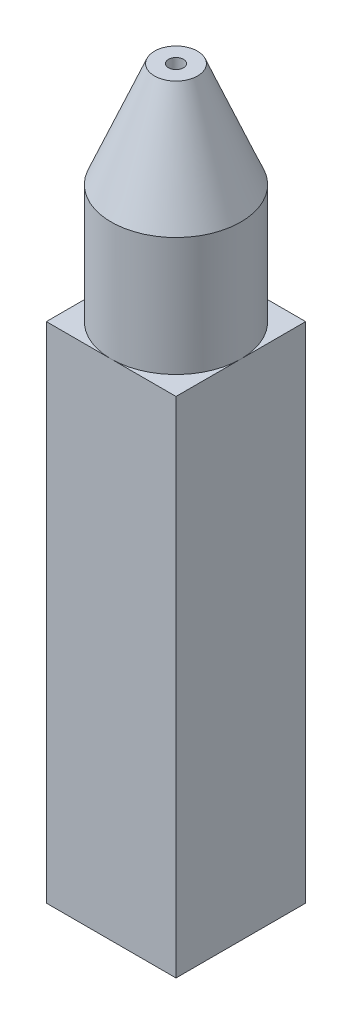
ISO-10303-21;
HEADER;
FILE_DESCRIPTION(('STEP AP214'),'2;1');
FILE_NAME('part.step','',(''),(''),'','','');
FILE_SCHEMA(('AUTOMOTIVE_DESIGN { 1 0 10303 214 1 1 1 1 }'));
ENDSEC;
DATA;
#1=APPLICATION_CONTEXT('core data for automotive mechanical design processes');
#2=APPLICATION_PROTOCOL_DEFINITION('international standard','automotive_design',2000,#1);
#3=PRODUCT_CONTEXT('',#1,'mechanical');
#4=PRODUCT('Part','Part','',(#3));
#5=PRODUCT_RELATED_PRODUCT_CATEGORY('part','',(#4));
#6=PRODUCT_DEFINITION_FORMATION('','',#4);
#7=PRODUCT_DEFINITION_CONTEXT('part definition',#1,'design');
#8=PRODUCT_DEFINITION('design','',#6,#7);
#9=PRODUCT_DEFINITION_SHAPE('','',#8);
#10=(LENGTH_UNIT() NAMED_UNIT(*) SI_UNIT(.MILLI.,.METRE.));
#11=(NAMED_UNIT(*) PLANE_ANGLE_UNIT() SI_UNIT($,.RADIAN.));
#12=(NAMED_UNIT(*) SI_UNIT($,.STERADIAN.) SOLID_ANGLE_UNIT());
#13=UNCERTAINTY_MEASURE_WITH_UNIT(LENGTH_MEASURE(1.E-05),#10,'distance_accuracy_value','');
#14=(GEOMETRIC_REPRESENTATION_CONTEXT(3) GLOBAL_UNCERTAINTY_ASSIGNED_CONTEXT((#13)) GLOBAL_UNIT_ASSIGNED_CONTEXT((#10,
#11,#12)) REPRESENTATION_CONTEXT('',''));
#15=CARTESIAN_POINT('',(0.,0.,0.));
#16=DIRECTION('',(0.,0.,1.));
#17=DIRECTION('',(1.,0.,0.));
#18=AXIS2_PLACEMENT_3D('',#15,#16,#17);
#19=CARTESIAN_POINT('',(0.,0.,0.));
#20=DIRECTION('',(0.,-1.,0.));
#21=DIRECTION('',(0.,0.,-1.));
#22=AXIS2_PLACEMENT_3D('',#19,#20,#21);
#23=PLANE('',#22);
#24=DIRECTION('',(1.,0.,0.));
#25=VECTOR('',#24,1.);
#26=CARTESIAN_POINT('',(0.,0.,2.9845));
#27=LINE('',#26,#25);
#28=CARTESIAN_POINT('',(-2.9845,0.,2.9845));
#29=VERTEX_POINT('',#28);
#30=CARTESIAN_POINT('',(2.9845,0.,2.9845));
#31=VERTEX_POINT('',#30);
#32=EDGE_CURVE('E131',#29,#31,#27,.T.);
#33=ORIENTED_EDGE('',*,*,#32,.F.);
#34=DIRECTION('',(0.,0.,-1.));
#35=VECTOR('',#34,1.);
#36=CARTESIAN_POINT('',(-2.9845,0.,0.));
#37=LINE('',#36,#35);
#38=CARTESIAN_POINT('',(-2.9845,0.,-2.9845));
#39=VERTEX_POINT('',#38);
#40=EDGE_CURVE('E125',#29,#39,#37,.T.);
#41=ORIENTED_EDGE('',*,*,#40,.T.);
#42=DIRECTION('',(1.,0.,0.));
#43=VECTOR('',#42,1.);
#44=CARTESIAN_POINT('',(0.,0.,-2.9845));
#45=LINE('',#44,#43);
#46=CARTESIAN_POINT('',(2.9845,0.,-2.9845));
#47=VERTEX_POINT('',#46);
#48=EDGE_CURVE('E129',#39,#47,#45,.T.);
#49=ORIENTED_EDGE('',*,*,#48,.T.);
#50=DIRECTION('',(0.,0.,-1.));
#51=VECTOR('',#50,1.);
#52=CARTESIAN_POINT('',(2.9845,0.,0.));
#53=LINE('',#52,#51);
#54=EDGE_CURVE('E176',#31,#47,#53,.T.);
#55=ORIENTED_EDGE('',*,*,#54,.F.);
#56=EDGE_LOOP('',(#33,#41,#49,#55));
#57=FACE_BOUND('',#56,.T.);
#58=CARTESIAN_POINT('',(0.,0.,0.));
#59=DIRECTION('',(0.,-1.,0.));
#60=DIRECTION('',(0.,0.,-1.));
#61=AXIS2_PLACEMENT_3D('',#58,#59,#60);
#62=CIRCLE('',#61,0.9906);
#63=CARTESIAN_POINT('',(0.,0.,-0.9906));
#64=VERTEX_POINT('',#63);
#65=EDGE_CURVE('E12',#64,#64,#62,.T.);
#66=ORIENTED_EDGE('',*,*,#65,.F.);
#67=EDGE_LOOP('',(#66));
#68=FACE_BOUND('',#67,.T.);
#69=ADVANCED_FACE('F71',(#57,#68),#23,.T.);
#70=CARTESIAN_POINT('',(0.,0.,0.));
#71=DIRECTION('',(0.,-1.,0.));
#72=DIRECTION('',(0.,0.,-1.));
#73=AXIS2_PLACEMENT_3D('',#70,#71,#72);
#74=CYLINDRICAL_SURFACE('',#73,0.9906);
#75=ORIENTED_EDGE('',*,*,#65,.T.);
#76=EDGE_LOOP('',(#75));
#77=FACE_BOUND('',#76,.T.);
#78=CARTESIAN_POINT('',(0.,8.19360069193763,0.));
#79=DIRECTION('',(0.,-1.,0.));
#80=DIRECTION('',(0.,0.,-1.));
#81=AXIS2_PLACEMENT_3D('',#78,#79,#80);
#82=CIRCLE('',#81,0.990600000000001);
#83=CARTESIAN_POINT('',(0.,8.19360069193763,-0.990600000000001));
#84=VERTEX_POINT('',#83);
#85=EDGE_CURVE('E78',#84,#84,#82,.T.);
#86=ORIENTED_EDGE('',*,*,#85,.F.);
#87=EDGE_LOOP('',(#86));
#88=FACE_BOUND('',#87,.T.);
#89=ADVANCED_FACE('F200',(#77,#88),#74,.F.);
#90=CARTESIAN_POINT('',(0.,9.31545,0.));
#91=DIRECTION('',(0.,-1.,0.));
#92=DIRECTION('',(0.,0.,-1.));
#93=AXIS2_PLACEMENT_3D('',#90,#91,#92);
#94=CONICAL_SURFACE('',#93,0.342899999999998,0.5235987755983);
#95=ORIENTED_EDGE('',*,*,#85,.T.);
#96=EDGE_LOOP('',(#95));
#97=FACE_BOUND('',#96,.T.);
#98=CARTESIAN_POINT('',(0.,9.31545,0.));
#99=DIRECTION('',(0.,-1.,0.));
#100=DIRECTION('',(0.,0.,-1.));
#101=AXIS2_PLACEMENT_3D('',#98,#99,#100);
#102=CIRCLE('',#101,0.342899999999998);
#103=CARTESIAN_POINT('',(0.,9.31545,-0.342899999999998));
#104=VERTEX_POINT('',#103);
#105=EDGE_CURVE('E192',#104,#104,#102,.T.);
#106=ORIENTED_EDGE('',*,*,#105,.F.);
#107=EDGE_LOOP('',(#106));
#108=FACE_BOUND('',#107,.T.);
#109=ADVANCED_FACE('F197',(#97,#108),#94,.F.);
#110=CARTESIAN_POINT('',(0.,0.,0.));
#111=DIRECTION('',(0.,-1.,0.));
#112=DIRECTION('',(0.,0.,-1.));
#113=AXIS2_PLACEMENT_3D('',#110,#111,#112);
#114=CYLINDRICAL_SURFACE('',#113,0.342899999999999);
#115=ORIENTED_EDGE('',*,*,#105,.T.);
#116=EDGE_LOOP('',(#115));
#117=FACE_BOUND('',#116,.T.);
#118=CARTESIAN_POINT('',(0.,33.47085,0.));
#119=DIRECTION('',(0.,-1.,0.));
#120=DIRECTION('',(0.,0.,-1.));
#121=AXIS2_PLACEMENT_3D('',#118,#119,#120);
#122=CIRCLE('',#121,0.3429);
#123=CARTESIAN_POINT('',(0.,33.47085,-0.3429));
#124=VERTEX_POINT('',#123);
#125=EDGE_CURVE('E189',#124,#124,#122,.T.);
#126=ORIENTED_EDGE('',*,*,#125,.F.);
#127=EDGE_LOOP('',(#126));
#128=FACE_BOUND('',#127,.T.);
#129=ADVANCED_FACE('F207',(#117,#128),#114,.F.);
#130=CARTESIAN_POINT('',(0.,33.47085,0.));
#131=DIRECTION('',(0.,-1.,0.));
#132=DIRECTION('',(0.,0.,-1.));
#133=AXIS2_PLACEMENT_3D('',#130,#131,#132);
#134=PLANE('',#133);
#135=CARTESIAN_POINT('',(0.,33.47085,0.));
#136=DIRECTION('',(0.,-1.,0.));
#137=DIRECTION('',(0.,0.,-1.));
#138=AXIS2_PLACEMENT_3D('',#135,#136,#137);
#139=CIRCLE('',#138,0.9906);
#140=CARTESIAN_POINT('',(0.,33.47085,-0.990599999999998));
#141=VERTEX_POINT('',#140);
#142=EDGE_CURVE('E186',#141,#141,#139,.T.);
#143=ORIENTED_EDGE('',*,*,#142,.F.);
#144=EDGE_LOOP('',(#143));
#145=FACE_BOUND('',#144,.T.);
#146=ORIENTED_EDGE('',*,*,#125,.T.);
#147=EDGE_LOOP('',(#146));
#148=FACE_BOUND('',#147,.T.);
#149=ADVANCED_FACE('F212',(#145,#148),#134,.F.);
#150=CARTESIAN_POINT('',(0.,33.47085,0.));
#151=DIRECTION('',(0.,-1.,0.));
#152=DIRECTION('',(0.,0.,-1.));
#153=AXIS2_PLACEMENT_3D('',#150,#151,#152);
#154=CONICAL_SURFACE('',#153,0.9906,0.391797676816774);
#155=CARTESIAN_POINT('',(0.,28.64485,0.));
#156=DIRECTION('',(0.,-1.,0.));
#157=DIRECTION('',(0.,0.,-1.));
#158=AXIS2_PLACEMENT_3D('',#155,#156,#157);
#159=CIRCLE('',#158,2.9845);
#160=CARTESIAN_POINT('',(0.,28.64485,-2.9845));
#161=VERTEX_POINT('',#160);
#162=EDGE_CURVE('E180',#161,#161,#159,.T.);
#163=CARTESIAN_POINT('',(0.,28.64485,-2.9845));
#164=CARTESIAN_POINT('',(0.,28.6951208333333,-2.96373020833334));
#165=CARTESIAN_POINT('',(0.,28.7453916666667,-2.94296041666667));
#166=CARTESIAN_POINT('',(0.,28.8459333333333,-2.90142083333334));
#167=CARTESIAN_POINT('',(0.,28.8962041666667,-2.88065104166667));
#168=CARTESIAN_POINT('',(0.,28.9967458333333,-2.83911145833333));
#169=CARTESIAN_POINT('',(0.,29.0470166666667,-2.81834166666667));
#170=CARTESIAN_POINT('',(0.,29.1475583333333,-2.77680208333333));
#171=CARTESIAN_POINT('',(0.,29.1978291666667,-2.75603229166667));
#172=CARTESIAN_POINT('',(0.,29.2983708333333,-2.71449270833333));
#173=CARTESIAN_POINT('',(0.,29.3486416666667,-2.69372291666667));
#174=CARTESIAN_POINT('',(0.,29.4491833333333,-2.65218333333333));
#175=CARTESIAN_POINT('',(0.,29.4994541666667,-2.63141354166667));
#176=CARTESIAN_POINT('',(0.,29.5999958333333,-2.58987395833333));
#177=CARTESIAN_POINT('',(0.,29.6502666666667,-2.56910416666667));
#178=CARTESIAN_POINT('',(0.,29.7508083333333,-2.52756458333333));
#179=CARTESIAN_POINT('',(0.,29.8010791666667,-2.50679479166667));
#180=CARTESIAN_POINT('',(0.,29.9016208333333,-2.46525520833333));
#181=CARTESIAN_POINT('',(0.,29.9518916666667,-2.44448541666667));
#182=CARTESIAN_POINT('',(0.,30.0524333333333,-2.40294583333333));
#183=CARTESIAN_POINT('',(0.,30.1027041666667,-2.38217604166667));
#184=CARTESIAN_POINT('',(0.,30.2032458333333,-2.34063645833333));
#185=CARTESIAN_POINT('',(0.,30.2535166666667,-2.31986666666667));
#186=CARTESIAN_POINT('',(0.,30.3540583333333,-2.27832708333333));
#187=CARTESIAN_POINT('',(0.,30.4043291666667,-2.25755729166667));
#188=CARTESIAN_POINT('',(0.,30.5048708333333,-2.21601770833333));
#189=CARTESIAN_POINT('',(0.,30.5551416666667,-2.19524791666667));
#190=CARTESIAN_POINT('',(0.,30.6556833333333,-2.15370833333333));
#191=CARTESIAN_POINT('',(0.,30.7059541666667,-2.13293854166667));
#192=CARTESIAN_POINT('',(0.,30.8064958333333,-2.09139895833333));
#193=CARTESIAN_POINT('',(0.,30.8567666666667,-2.07062916666667));
#194=CARTESIAN_POINT('',(0.,30.9573083333333,-2.02908958333333));
#195=CARTESIAN_POINT('',(0.,31.0075791666667,-2.00831979166667));
#196=CARTESIAN_POINT('',(0.,31.1081208333333,-1.96678020833333));
#197=CARTESIAN_POINT('',(0.,31.1583916666667,-1.94601041666667));
#198=CARTESIAN_POINT('',(0.,31.2589333333333,-1.90447083333333));
#199=CARTESIAN_POINT('',(0.,31.3092041666667,-1.88370104166667));
#200=CARTESIAN_POINT('',(0.,31.4097458333333,-1.84216145833333));
#201=CARTESIAN_POINT('',(0.,31.4600166666667,-1.82139166666667));
#202=CARTESIAN_POINT('',(0.,31.5605583333333,-1.77985208333333));
#203=CARTESIAN_POINT('',(0.,31.6108291666667,-1.75908229166667));
#204=CARTESIAN_POINT('',(0.,31.7113708333333,-1.71754270833333));
#205=CARTESIAN_POINT('',(0.,31.7616416666667,-1.69677291666667));
#206=CARTESIAN_POINT('',(0.,31.8621833333333,-1.65523333333333));
#207=CARTESIAN_POINT('',(0.,31.9124541666667,-1.63446354166667));
#208=CARTESIAN_POINT('',(0.,32.0129958333333,-1.59292395833333));
#209=CARTESIAN_POINT('',(0.,32.0632666666667,-1.57215416666667));
#210=CARTESIAN_POINT('',(0.,32.1638083333333,-1.53061458333333));
#211=CARTESIAN_POINT('',(0.,32.2140791666667,-1.50984479166667));
#212=CARTESIAN_POINT('',(0.,32.3146208333333,-1.46830520833333));
#213=CARTESIAN_POINT('',(0.,32.3648916666667,-1.44753541666667));
#214=CARTESIAN_POINT('',(0.,32.4654333333333,-1.40599583333333));
#215=CARTESIAN_POINT('',(0.,32.5157041666667,-1.38522604166667));
#216=CARTESIAN_POINT('',(0.,32.6162458333333,-1.34368645833333));
#217=CARTESIAN_POINT('',(0.,32.6665166666667,-1.32291666666667));
#218=CARTESIAN_POINT('',(0.,32.7670583333333,-1.28137708333333));
#219=CARTESIAN_POINT('',(0.,32.8173291666667,-1.26060729166667));
#220=CARTESIAN_POINT('',(0.,32.9178708333333,-1.21906770833333));
#221=CARTESIAN_POINT('',(0.,32.9681416666667,-1.19829791666667));
#222=CARTESIAN_POINT('',(0.,33.0686833333333,-1.15675833333333));
#223=CARTESIAN_POINT('',(0.,33.1189541666667,-1.13598854166667));
#224=CARTESIAN_POINT('',(0.,33.2194958333333,-1.09444895833333));
#225=CARTESIAN_POINT('',(0.,33.2697666666667,-1.07367916666667));
#226=CARTESIAN_POINT('',(0.,33.3703083333333,-1.03213958333333));
#227=CARTESIAN_POINT('',(0.,33.4205791666667,-1.01136979166667));
#228=CARTESIAN_POINT('',(0.,33.47085,-0.990599999999998));
#229=B_SPLINE_CURVE_WITH_KNOTS('',3,(#163,#164,#165,#166,#167,#168,#169,#170,#171,#172,#173,
#174,#175,#176,#177,#178,#179,#180,#181,#182,#183,#184,#185,#186,#187,#188,#189,#190,#191,#192,
#193,#194,#195,#196,#197,#198,#199,#200,#201,#202,#203,#204,#205,#206,#207,#208,#209,#210,#211,
#212,#213,#214,#215,#216,#217,#218,#219,#220,#221,#222,#223,#224,#225,#226,#227,#228),
.UNSPECIFIED.,.F.,.F.,(4,2,2,2,2,2,2,2,2,2,2,2,2,2,2,2,2,2,2,2,2,2,2,2,2,2,2,2,2,2,2,2,4),(0.,
0.163177413783712,0.326354827567423,0.489532241351135,0.652709655134846,0.815887068918558,
0.979064482702269,1.14224189648598,1.30541931026969,1.4685967240534,1.63177413783712,
1.79495155162083,1.95812896540454,2.12130637918825,2.28448379297196,2.44766120675567,
2.61083862053938,2.7740160343231,2.93719344810681,3.10037086189052,3.26354827567423,
3.42672568945794,3.58990310324165,3.75308051702537,3.91625793080908,4.07943534459279,
4.2426127583765,4.40579017216021,4.56896758594392,4.73214499972764,4.89532241351135,
5.05849982729506,5.22167724107877),.UNSPECIFIED.);
#230=EDGE_CURVE('BSEAM216',#161,#141,#229,.T.);
#231=ORIENTED_EDGE('',*,*,#162,.F.);
#232=ORIENTED_EDGE('',*,*,#142,.T.);
#233=ORIENTED_EDGE('',*,*,#230,.T.);
#234=ORIENTED_EDGE('',*,*,#230,.F.);
#235=EDGE_LOOP('',(#231,#233,#232,#234));
#236=FACE_BOUND('',#235,.T.);
#237=ADVANCED_FACE('F216',(#236),#154,.T.);
#238=CARTESIAN_POINT('',(0.,0.,0.));
#239=DIRECTION('',(0.,-1.,0.));
#240=DIRECTION('',(0.,0.,-1.));
#241=AXIS2_PLACEMENT_3D('',#238,#239,#240);
#242=CYLINDRICAL_SURFACE('',#241,2.9845);
#243=CARTESIAN_POINT('',(0.,23.18385,0.));
#244=DIRECTION('',(0.,1.,0.));
#245=DIRECTION('',(0.,0.,1.));
#246=AXIS2_PLACEMENT_3D('',#243,#244,#245);
#247=CIRCLE('',#246,2.9845);
#248=CARTESIAN_POINT('',(0.,23.18385,-2.9845));
#249=VERTEX_POINT('',#248);
#250=CARTESIAN_POINT('',(2.9845,23.18385,0.));
#251=VERTEX_POINT('',#250);
#252=EDGE_CURVE('E85',#249,#251,#247,.F.);
#253=ORIENTED_EDGE('',*,*,#252,.F.);
#254=CARTESIAN_POINT('',(0.,23.18385,0.));
#255=DIRECTION('',(0.,1.,0.));
#256=DIRECTION('',(0.,0.,1.));
#257=AXIS2_PLACEMENT_3D('',#254,#255,#256);
#258=CIRCLE('',#257,2.9845);
#259=CARTESIAN_POINT('',(-2.9845,23.18385,0.));
#260=VERTEX_POINT('',#259);
#261=EDGE_CURVE('E160',#260,#249,#258,.F.);
#262=ORIENTED_EDGE('',*,*,#261,.F.);
#263=CARTESIAN_POINT('',(0.,23.18385,0.));
#264=DIRECTION('',(0.,1.,0.));
#265=DIRECTION('',(0.,0.,1.));
#266=AXIS2_PLACEMENT_3D('',#263,#264,#265);
#267=CIRCLE('',#266,2.9845);
#268=CARTESIAN_POINT('',(0.,23.18385,2.9845));
#269=VERTEX_POINT('',#268);
#270=EDGE_CURVE('E137',#269,#260,#267,.F.);
#271=ORIENTED_EDGE('',*,*,#270,.F.);
#272=CARTESIAN_POINT('',(0.,23.18385,0.));
#273=DIRECTION('',(0.,1.,0.));
#274=DIRECTION('',(0.,0.,1.));
#275=AXIS2_PLACEMENT_3D('',#272,#273,#274);
#276=CIRCLE('',#275,2.9845);
#277=EDGE_CURVE('E178',#251,#269,#276,.F.);
#278=ORIENTED_EDGE('',*,*,#277,.F.);
#279=EDGE_LOOP('',(#253,#262,#271,#278));
#280=FACE_BOUND('',#279,.T.);
#281=ORIENTED_EDGE('',*,*,#162,.T.);
#282=EDGE_LOOP('',(#281));
#283=FACE_BOUND('',#282,.T.);
#284=ADVANCED_FACE('F220',(#280,#283),#242,.T.);
#285=CARTESIAN_POINT('',(2.9845,27.4045703769025,0.));
#286=DIRECTION('',(-1.,0.,0.));
#287=DIRECTION('',(0.,0.,1.));
#288=AXIS2_PLACEMENT_3D('',#285,#286,#287);
#289=PLANE('',#288);
#290=DIRECTION('',(0.,0.,-1.));
#291=VECTOR('',#290,1.);
#292=CARTESIAN_POINT('',(2.9845,23.18385,0.));
#293=LINE('',#292,#291);
#294=CARTESIAN_POINT('',(2.9845,23.18385,2.9845));
#295=VERTEX_POINT('',#294);
#296=EDGE_CURVE('E93',#295,#251,#293,.T.);
#297=ORIENTED_EDGE('',*,*,#296,.F.);
#298=DIRECTION('',(0.,-1.,0.));
#299=VECTOR('',#298,1.);
#300=CARTESIAN_POINT('',(2.9845,27.4045703769025,2.9845));
#301=LINE('',#300,#299);
#302=EDGE_CURVE('E169',#295,#31,#301,.T.);
#303=ORIENTED_EDGE('',*,*,#302,.T.);
#304=ORIENTED_EDGE('',*,*,#54,.T.);
#305=DIRECTION('',(0.,-1.,0.));
#306=VECTOR('',#305,1.);
#307=CARTESIAN_POINT('',(2.9845,27.4045703769025,-2.9845));
#308=LINE('',#307,#306);
#309=CARTESIAN_POINT('',(2.9845,23.18385,-2.9845));
#310=VERTEX_POINT('',#309);
#311=EDGE_CURVE('E146',#310,#47,#308,.T.);
#312=ORIENTED_EDGE('',*,*,#311,.F.);
#313=DIRECTION('',(0.,0.,-1.));
#314=VECTOR('',#313,1.);
#315=CARTESIAN_POINT('',(2.9845,23.18385,0.));
#316=LINE('',#315,#314);
#317=EDGE_CURVE('E163',#251,#310,#316,.T.);
#318=ORIENTED_EDGE('',*,*,#317,.F.);
#319=EDGE_LOOP('',(#297,#303,#304,#312,#318));
#320=FACE_BOUND('',#319,.T.);
#321=ADVANCED_FACE('F224',(#320),#289,.F.);
#322=CARTESIAN_POINT('',(0.,27.4045703769025,2.9845));
#323=DIRECTION('',(0.,0.,-1.));
#324=DIRECTION('',(-1.,0.,0.));
#325=AXIS2_PLACEMENT_3D('',#322,#323,#324);
#326=PLANE('',#325);
#327=DIRECTION('',(1.,0.,0.));
#328=VECTOR('',#327,1.);
#329=CARTESIAN_POINT('',(0.,23.18385,2.9845));
#330=LINE('',#329,#328);
#331=EDGE_CURVE('E175',#269,#295,#330,.T.);
#332=ORIENTED_EDGE('',*,*,#331,.F.);
#333=DIRECTION('',(1.,0.,0.));
#334=VECTOR('',#333,1.);
#335=CARTESIAN_POINT('',(0.,23.18385,2.9845));
#336=LINE('',#335,#334);
#337=CARTESIAN_POINT('',(-2.9845,23.18385,2.9845));
#338=VERTEX_POINT('',#337);
#339=EDGE_CURVE('E165',#338,#269,#336,.T.);
#340=ORIENTED_EDGE('',*,*,#339,.F.);
#341=DIRECTION('',(0.,-1.,0.));
#342=VECTOR('',#341,1.);
#343=CARTESIAN_POINT('',(-2.9845,27.4045703769025,2.9845));
#344=LINE('',#343,#342);
#345=EDGE_CURVE('E167',#338,#29,#344,.T.);
#346=ORIENTED_EDGE('',*,*,#345,.T.);
#347=ORIENTED_EDGE('',*,*,#32,.T.);
#348=ORIENTED_EDGE('',*,*,#302,.F.);
#349=EDGE_LOOP('',(#332,#340,#346,#347,#348));
#350=FACE_BOUND('',#349,.T.);
#351=ADVANCED_FACE('F229',(#350),#326,.F.);
#352=CARTESIAN_POINT('',(0.,23.18385,0.));
#353=DIRECTION('',(0.,1.,0.));
#354=DIRECTION('',(0.,0.,1.));
#355=AXIS2_PLACEMENT_3D('',#352,#353,#354);
#356=PLANE('',#355);
#357=ORIENTED_EDGE('',*,*,#331,.T.);
#358=ORIENTED_EDGE('',*,*,#296,.T.);
#359=ORIENTED_EDGE('',*,*,#277,.T.);
#360=EDGE_LOOP('',(#357,#358,#359));
#361=FACE_BOUND('',#360,.T.);
#362=ADVANCED_FACE('F225',(#361),#356,.T.);
#363=CARTESIAN_POINT('',(0.,23.18385,0.));
#364=DIRECTION('',(0.,1.,0.));
#365=DIRECTION('',(0.,0.,1.));
#366=AXIS2_PLACEMENT_3D('',#363,#364,#365);
#367=PLANE('',#366);
#368=DIRECTION('',(0.,0.,-1.));
#369=VECTOR('',#368,1.);
#370=CARTESIAN_POINT('',(-2.9845,23.18385,0.));
#371=LINE('',#370,#369);
#372=EDGE_CURVE('E136',#338,#260,#371,.T.);
#373=ORIENTED_EDGE('',*,*,#372,.F.);
#374=ORIENTED_EDGE('',*,*,#339,.T.);
#375=ORIENTED_EDGE('',*,*,#270,.T.);
#376=EDGE_LOOP('',(#373,#374,#375));
#377=FACE_BOUND('',#376,.T.);
#378=ADVANCED_FACE('F228',(#377),#367,.T.);
#379=CARTESIAN_POINT('',(-2.9845,27.4045703769025,0.));
#380=DIRECTION('',(-1.,0.,0.));
#381=DIRECTION('',(0.,0.,1.));
#382=AXIS2_PLACEMENT_3D('',#379,#380,#381);
#383=PLANE('',#382);
#384=ORIENTED_EDGE('',*,*,#345,.F.);
#385=ORIENTED_EDGE('',*,*,#372,.T.);
#386=DIRECTION('',(0.,0.,-1.));
#387=VECTOR('',#386,1.);
#388=CARTESIAN_POINT('',(-2.9845,23.18385,0.));
#389=LINE('',#388,#387);
#390=CARTESIAN_POINT('',(-2.9845,23.18385,-2.9845));
#391=VERTEX_POINT('',#390);
#392=EDGE_CURVE('E152',#260,#391,#389,.T.);
#393=ORIENTED_EDGE('',*,*,#392,.T.);
#394=DIRECTION('',(0.,-1.,0.));
#395=VECTOR('',#394,1.);
#396=CARTESIAN_POINT('',(-2.9845,27.4045703769025,-2.9845));
#397=LINE('',#396,#395);
#398=EDGE_CURVE('E144',#391,#39,#397,.T.);
#399=ORIENTED_EDGE('',*,*,#398,.T.);
#400=ORIENTED_EDGE('',*,*,#40,.F.);
#401=EDGE_LOOP('',(#384,#385,#393,#399,#400));
#402=FACE_BOUND('',#401,.T.);
#403=ADVANCED_FACE('F149',(#402),#383,.T.);
#404=CARTESIAN_POINT('',(0.,27.4045703769025,-2.9845));
#405=DIRECTION('',(0.,0.,-1.));
#406=DIRECTION('',(-1.,0.,0.));
#407=AXIS2_PLACEMENT_3D('',#404,#405,#406);
#408=PLANE('',#407);
#409=ORIENTED_EDGE('',*,*,#48,.F.);
#410=ORIENTED_EDGE('',*,*,#398,.F.);
#411=DIRECTION('',(1.,0.,0.));
#412=VECTOR('',#411,1.);
#413=CARTESIAN_POINT('',(0.,23.18385,-2.9845));
#414=LINE('',#413,#412);
#415=EDGE_CURVE('E156',#391,#249,#414,.T.);
#416=ORIENTED_EDGE('',*,*,#415,.T.);
#417=DIRECTION('',(1.,0.,0.));
#418=VECTOR('',#417,1.);
#419=CARTESIAN_POINT('',(0.,23.18385,-2.9845));
#420=LINE('',#419,#418);
#421=EDGE_CURVE('E153',#249,#310,#420,.T.);
#422=ORIENTED_EDGE('',*,*,#421,.T.);
#423=ORIENTED_EDGE('',*,*,#311,.T.);
#424=EDGE_LOOP('',(#409,#410,#416,#422,#423));
#425=FACE_BOUND('',#424,.T.);
#426=ADVANCED_FACE('F142',(#425),#408,.T.);
#427=CARTESIAN_POINT('',(0.,23.18385,0.));
#428=DIRECTION('',(0.,1.,0.));
#429=DIRECTION('',(0.,0.,1.));
#430=AXIS2_PLACEMENT_3D('',#427,#428,#429);
#431=PLANE('',#430);
#432=ORIENTED_EDGE('',*,*,#252,.T.);
#433=ORIENTED_EDGE('',*,*,#317,.T.);
#434=ORIENTED_EDGE('',*,*,#421,.F.);
#435=EDGE_LOOP('',(#432,#433,#434));
#436=FACE_BOUND('',#435,.T.);
#437=ADVANCED_FACE('F243',(#436),#431,.T.);
#438=CARTESIAN_POINT('',(0.,23.18385,0.));
#439=DIRECTION('',(0.,1.,0.));
#440=DIRECTION('',(0.,0.,1.));
#441=AXIS2_PLACEMENT_3D('',#438,#439,#440);
#442=PLANE('',#441);
#443=ORIENTED_EDGE('',*,*,#392,.F.);
#444=ORIENTED_EDGE('',*,*,#261,.T.);
#445=ORIENTED_EDGE('',*,*,#415,.F.);
#446=EDGE_LOOP('',(#443,#444,#445));
#447=FACE_BOUND('',#446,.T.);
#448=ADVANCED_FACE('F246',(#447),#442,.T.);
#449=CLOSED_SHELL('',(#69,#89,#109,#129,#149,#237,#284,#321,#351,#362,#378,#403,#426,#437,#448));
#450=MANIFOLD_SOLID_BREP('B2',#449);
#451=ADVANCED_BREP_SHAPE_REPRESENTATION('',(#18,#450),#14);
#452=SHAPE_DEFINITION_REPRESENTATION(#9,#451);
ENDSEC;
END-ISO-10303-21;
